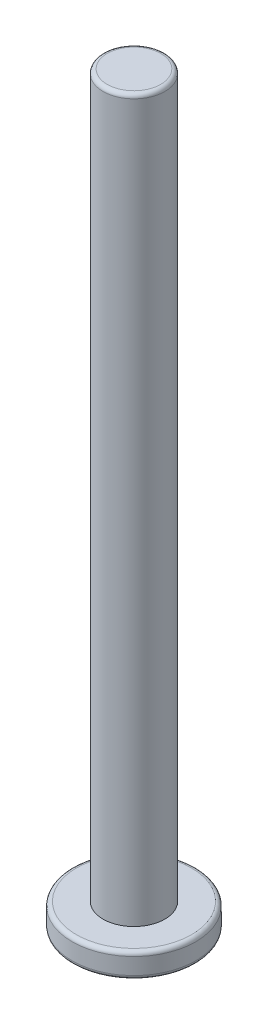
ISO-10303-21;
HEADER;
FILE_DESCRIPTION(('STEP AP214'),'2;1');
FILE_NAME('part.step','',(''),(''),'','','');
FILE_SCHEMA(('AUTOMOTIVE_DESIGN { 1 0 10303 214 1 1 1 1 }'));
ENDSEC;
DATA;
#1=APPLICATION_CONTEXT('core data for automotive mechanical design processes');
#2=APPLICATION_PROTOCOL_DEFINITION('international standard','automotive_design',2000,#1);
#3=PRODUCT_CONTEXT('',#1,'mechanical');
#4=PRODUCT('Part','Part','',(#3));
#5=PRODUCT_RELATED_PRODUCT_CATEGORY('part','',(#4));
#6=PRODUCT_DEFINITION_FORMATION('','',#4);
#7=PRODUCT_DEFINITION_CONTEXT('part definition',#1,'design');
#8=PRODUCT_DEFINITION('design','',#6,#7);
#9=PRODUCT_DEFINITION_SHAPE('','',#8);
#10=(LENGTH_UNIT() NAMED_UNIT(*) SI_UNIT(.MILLI.,.METRE.));
#11=(NAMED_UNIT(*) PLANE_ANGLE_UNIT() SI_UNIT($,.RADIAN.));
#12=(NAMED_UNIT(*) SI_UNIT($,.STERADIAN.) SOLID_ANGLE_UNIT());
#13=UNCERTAINTY_MEASURE_WITH_UNIT(LENGTH_MEASURE(1.E-05),#10,'distance_accuracy_value','');
#14=(GEOMETRIC_REPRESENTATION_CONTEXT(3) GLOBAL_UNCERTAINTY_ASSIGNED_CONTEXT((#13)) GLOBAL_UNIT_ASSIGNED_CONTEXT((#10,
#11,#12)) REPRESENTATION_CONTEXT('',''));
#15=CARTESIAN_POINT('',(0.,0.,0.));
#16=DIRECTION('',(0.,0.,1.));
#17=DIRECTION('',(1.,0.,0.));
#18=AXIS2_PLACEMENT_3D('',#15,#16,#17);
#19=CARTESIAN_POINT('',(0.,0.,0.));
#20=DIRECTION('',(0.,1.,0.));
#21=DIRECTION('',(0.,0.,1.));
#22=AXIS2_PLACEMENT_3D('',#19,#20,#21);
#23=PLANE('',#22);
#24=DIRECTION('',(-0.5,0.,0.866025403784439));
#25=VECTOR('',#24,1.);
#26=CARTESIAN_POINT('',(1.44337567297406,0.,0.));
#27=LINE('',#26,#25);
#28=CARTESIAN_POINT('',(1.44337567297406,0.,0.));
#29=VERTEX_POINT('',#28);
#30=CARTESIAN_POINT('',(0.721687836487032,0.,1.25));
#31=VERTEX_POINT('',#30);
#32=EDGE_CURVE('E122',#29,#31,#27,.T.);
#33=ORIENTED_EDGE('',*,*,#32,.F.);
#34=DIRECTION('',(0.5,0.,0.866025403784439));
#35=VECTOR('',#34,1.);
#36=CARTESIAN_POINT('',(0.721687836487032,0.,-1.25));
#37=LINE('',#36,#35);
#38=CARTESIAN_POINT('',(0.721687836487032,0.,-1.25));
#39=VERTEX_POINT('',#38);
#40=EDGE_CURVE('E48',#39,#29,#37,.T.);
#41=ORIENTED_EDGE('',*,*,#40,.F.);
#42=DIRECTION('',(1.,0.,0.));
#43=VECTOR('',#42,1.);
#44=CARTESIAN_POINT('',(-0.721687836487032,0.,-1.25));
#45=LINE('',#44,#43);
#46=CARTESIAN_POINT('',(-0.721687836487032,0.,-1.25));
#47=VERTEX_POINT('',#46);
#48=EDGE_CURVE('E131',#47,#39,#45,.T.);
#49=ORIENTED_EDGE('',*,*,#48,.F.);
#50=DIRECTION('',(0.5,0.,-0.866025403784439));
#51=VECTOR('',#50,1.);
#52=CARTESIAN_POINT('',(-1.44337567297407,0.,0.));
#53=LINE('',#52,#51);
#54=CARTESIAN_POINT('',(-1.44337567297407,0.,0.));
#55=VERTEX_POINT('',#54);
#56=EDGE_CURVE('E129',#55,#47,#53,.T.);
#57=ORIENTED_EDGE('',*,*,#56,.F.);
#58=DIRECTION('',(-0.5,0.,-0.866025403784439));
#59=VECTOR('',#58,1.);
#60=CARTESIAN_POINT('',(-0.721687836487033,0.,1.25));
#61=LINE('',#60,#59);
#62=CARTESIAN_POINT('',(-0.721687836487033,0.,1.25));
#63=VERTEX_POINT('',#62);
#64=EDGE_CURVE('E96',#63,#55,#61,.T.);
#65=ORIENTED_EDGE('',*,*,#64,.F.);
#66=DIRECTION('',(-1.,0.,0.));
#67=VECTOR('',#66,1.);
#68=CARTESIAN_POINT('',(0.721687836487032,0.,1.25));
#69=LINE('',#68,#67);
#70=EDGE_CURVE('E125',#31,#63,#69,.T.);
#71=ORIENTED_EDGE('',*,*,#70,.F.);
#72=EDGE_LOOP('',(#33,#41,#49,#57,#65,#71));
#73=FACE_BOUND('',#72,.T.);
#74=CARTESIAN_POINT('',(0.,0.,0.));
#75=DIRECTION('',(0.,1.,0.));
#76=DIRECTION('',(0.,0.,1.));
#77=AXIS2_PLACEMENT_3D('',#74,#75,#76);
#78=CIRCLE('',#77,2.8);
#79=CARTESIAN_POINT('',(0.,0.,2.8));
#80=VERTEX_POINT('',#79);
#81=EDGE_CURVE('E11',#80,#80,#78,.F.);
#82=ORIENTED_EDGE('',*,*,#81,.T.);
#83=EDGE_LOOP('',(#82));
#84=FACE_BOUND('',#83,.T.);
#85=ADVANCED_FACE('F33',(#73,#84),#23,.F.);
#86=CARTESIAN_POINT('',(0.,73.1142663620776,0.));
#87=DIRECTION('',(0.,1.,0.));
#88=DIRECTION('',(0.,0.,1.));
#89=AXIS2_PLACEMENT_3D('',#86,#87,#88);
#90=CYLINDRICAL_SURFACE('',#89,3.);
#91=CARTESIAN_POINT('',(0.,1.,0.));
#92=DIRECTION('',(0.,-1.,0.));
#93=DIRECTION('',(0.,0.,-1.));
#94=AXIS2_PLACEMENT_3D('',#91,#92,#93);
#95=CIRCLE('',#94,3.);
#96=CARTESIAN_POINT('',(0.,1.,-3.));
#97=VERTEX_POINT('',#96);
#98=EDGE_CURVE('E149',#97,#97,#95,.T.);
#99=ORIENTED_EDGE('',*,*,#98,.T.);
#100=EDGE_LOOP('',(#99));
#101=FACE_BOUND('',#100,.T.);
#102=CARTESIAN_POINT('',(0.,0.200000000000006,0.));
#103=DIRECTION('',(0.,1.,0.));
#104=DIRECTION('',(0.,0.,1.));
#105=AXIS2_PLACEMENT_3D('',#102,#103,#104);
#106=CIRCLE('',#105,3.);
#107=CARTESIAN_POINT('',(0.,0.200000000000006,3.));
#108=VERTEX_POINT('',#107);
#109=EDGE_CURVE('E146',#108,#108,#106,.T.);
#110=ORIENTED_EDGE('',*,*,#109,.T.);
#111=EDGE_LOOP('',(#110));
#112=FACE_BOUND('',#111,.T.);
#113=ADVANCED_FACE('F179',(#101,#112),#90,.T.);
#114=CARTESIAN_POINT('',(3.,1.2,0.));
#115=DIRECTION('',(0.,-1.,0.));
#116=DIRECTION('',(0.,0.,-1.));
#117=AXIS2_PLACEMENT_3D('',#114,#115,#116);
#118=PLANE('',#117);
#119=CARTESIAN_POINT('',(0.,1.2,0.));
#120=DIRECTION('',(0.,-1.,0.));
#121=DIRECTION('',(0.,0.,-1.));
#122=AXIS2_PLACEMENT_3D('',#119,#120,#121);
#123=CIRCLE('',#122,2.8);
#124=CARTESIAN_POINT('',(0.,1.2,-2.8));
#125=VERTEX_POINT('',#124);
#126=EDGE_CURVE('E143',#125,#125,#123,.F.);
#127=ORIENTED_EDGE('',*,*,#126,.T.);
#128=EDGE_LOOP('',(#127));
#129=FACE_BOUND('',#128,.T.);
#130=CARTESIAN_POINT('',(0.,1.19999999999999,0.));
#131=DIRECTION('',(0.,1.,0.));
#132=DIRECTION('',(0.,0.,1.));
#133=AXIS2_PLACEMENT_3D('',#130,#131,#132);
#134=CIRCLE('',#133,1.5);
#135=CARTESIAN_POINT('',(0.,1.19999999999999,1.5));
#136=VERTEX_POINT('',#135);
#137=EDGE_CURVE('E135',#136,#136,#134,.T.);
#138=ORIENTED_EDGE('',*,*,#137,.F.);
#139=EDGE_LOOP('',(#138));
#140=FACE_BOUND('',#139,.T.);
#141=ADVANCED_FACE('F175',(#129,#140),#118,.F.);
#142=CARTESIAN_POINT('',(0.,73.1142663620776,0.));
#143=DIRECTION('',(0.,1.,0.));
#144=DIRECTION('',(0.,0.,1.));
#145=AXIS2_PLACEMENT_3D('',#142,#143,#144);
#146=CYLINDRICAL_SURFACE('',#145,1.5);
#147=CARTESIAN_POINT('',(0.,36.,0.));
#148=DIRECTION('',(0.,-1.,0.));
#149=DIRECTION('',(0.,0.,-1.));
#150=AXIS2_PLACEMENT_3D('',#147,#148,#149);
#151=CIRCLE('',#150,1.5);
#152=CARTESIAN_POINT('',(0.,36.,-1.5));
#153=VERTEX_POINT('',#152);
#154=EDGE_CURVE('E41',#153,#153,#151,.T.);
#155=ORIENTED_EDGE('',*,*,#154,.T.);
#156=EDGE_LOOP('',(#155));
#157=FACE_BOUND('',#156,.T.);
#158=ORIENTED_EDGE('',*,*,#137,.T.);
#159=EDGE_LOOP('',(#158));
#160=FACE_BOUND('',#159,.T.);
#161=ADVANCED_FACE('F157',(#157,#160),#146,.T.);
#162=CARTESIAN_POINT('',(1.5,36.2,0.));
#163=DIRECTION('',(0.,-1.,0.));
#164=DIRECTION('',(0.,0.,-1.));
#165=AXIS2_PLACEMENT_3D('',#162,#163,#164);
#166=PLANE('',#165);
#167=CARTESIAN_POINT('',(0.,36.2,0.));
#168=DIRECTION('',(0.,-1.,0.));
#169=DIRECTION('',(0.,0.,-1.));
#170=AXIS2_PLACEMENT_3D('',#167,#168,#169);
#171=CIRCLE('',#170,1.3);
#172=CARTESIAN_POINT('',(0.,36.2,-1.3));
#173=VERTEX_POINT('',#172);
#174=EDGE_CURVE('E152',#173,#173,#171,.F.);
#175=ORIENTED_EDGE('',*,*,#174,.T.);
#176=EDGE_LOOP('',(#175));
#177=FACE_BOUND('',#176,.T.);
#178=ADVANCED_FACE('F166',(#177),#166,.F.);
#179=CARTESIAN_POINT('',(0.,1.,0.));
#180=DIRECTION('',(0.,-1.,0.));
#181=DIRECTION('',(0.,0.,-1.));
#182=AXIS2_PLACEMENT_3D('',#179,#180,#181);
#183=TOROIDAL_SURFACE('',#182,2.8,0.2);
#184=ORIENTED_EDGE('',*,*,#98,.F.);
#185=EDGE_LOOP('',(#184));
#186=FACE_BOUND('',#185,.T.);
#187=ORIENTED_EDGE('',*,*,#126,.F.);
#188=EDGE_LOOP('',(#187));
#189=FACE_BOUND('',#188,.T.);
#190=ADVANCED_FACE('F163',(#186,#189),#183,.T.);
#191=CARTESIAN_POINT('',(0.,36.,0.));
#192=DIRECTION('',(0.,-1.,0.));
#193=DIRECTION('',(0.,0.,-1.));
#194=AXIS2_PLACEMENT_3D('',#191,#192,#193);
#195=TOROIDAL_SURFACE('',#194,1.3,0.2);
#196=ORIENTED_EDGE('',*,*,#154,.F.);
#197=EDGE_LOOP('',(#196));
#198=FACE_BOUND('',#197,.T.);
#199=ORIENTED_EDGE('',*,*,#174,.F.);
#200=EDGE_LOOP('',(#199));
#201=FACE_BOUND('',#200,.T.);
#202=ADVANCED_FACE('F160',(#198,#201),#195,.T.);
#203=CARTESIAN_POINT('',(0.,0.200000000000006,0.));
#204=DIRECTION('',(0.,1.,0.));
#205=DIRECTION('',(0.,0.,1.));
#206=AXIS2_PLACEMENT_3D('',#203,#204,#205);
#207=TOROIDAL_SURFACE('',#206,2.8,0.2);
#208=ORIENTED_EDGE('',*,*,#81,.F.);
#209=EDGE_LOOP('',(#208));
#210=FACE_BOUND('',#209,.T.);
#211=ORIENTED_EDGE('',*,*,#109,.F.);
#212=EDGE_LOOP('',(#211));
#213=FACE_BOUND('',#212,.T.);
#214=ADVANCED_FACE('F35',(#210,#213),#207,.T.);
#215=CARTESIAN_POINT('',(0.721687836487032,1.,-1.25));
#216=DIRECTION('',(0.866025403784439,0.,-0.5));
#217=DIRECTION('',(-0.5,0.,-0.866025403784439));
#218=AXIS2_PLACEMENT_3D('',#215,#216,#217);
#219=PLANE('',#218);
#220=ORIENTED_EDGE('',*,*,#40,.T.);
#221=DIRECTION('',(0.,-1.,0.));
#222=VECTOR('',#221,1.);
#223=CARTESIAN_POINT('',(1.44337567297406,1.,0.));
#224=LINE('',#223,#222);
#225=CARTESIAN_POINT('',(1.44337567297406,1.,0.));
#226=VERTEX_POINT('',#225);
#227=EDGE_CURVE('E78',#226,#29,#224,.T.);
#228=ORIENTED_EDGE('',*,*,#227,.F.);
#229=DIRECTION('',(0.5,0.,0.866025403784439));
#230=VECTOR('',#229,1.);
#231=CARTESIAN_POINT('',(0.721687836487032,1.,-1.25));
#232=LINE('',#231,#230);
#233=CARTESIAN_POINT('',(0.721687836487032,1.,-1.25));
#234=VERTEX_POINT('',#233);
#235=EDGE_CURVE('E133',#234,#226,#232,.T.);
#236=ORIENTED_EDGE('',*,*,#235,.F.);
#237=DIRECTION('',(0.,-1.,0.));
#238=VECTOR('',#237,1.);
#239=CARTESIAN_POINT('',(0.721687836487032,1.,-1.25));
#240=LINE('',#239,#238);
#241=EDGE_CURVE('E56',#234,#39,#240,.T.);
#242=ORIENTED_EDGE('',*,*,#241,.T.);
#243=EDGE_LOOP('',(#220,#228,#236,#242));
#244=FACE_BOUND('',#243,.T.);
#245=ADVANCED_FACE('F228',(#244),#219,.F.);
#246=CARTESIAN_POINT('',(-0.721687836487032,1.,-1.25));
#247=DIRECTION('',(0.,0.,-1.));
#248=DIRECTION('',(-1.,0.,0.));
#249=AXIS2_PLACEMENT_3D('',#246,#247,#248);
#250=PLANE('',#249);
#251=ORIENTED_EDGE('',*,*,#48,.T.);
#252=ORIENTED_EDGE('',*,*,#241,.F.);
#253=DIRECTION('',(1.,0.,0.));
#254=VECTOR('',#253,1.);
#255=CARTESIAN_POINT('',(-0.721687836487032,1.,-1.25));
#256=LINE('',#255,#254);
#257=CARTESIAN_POINT('',(-0.721687836487032,1.,-1.25));
#258=VERTEX_POINT('',#257);
#259=EDGE_CURVE('E108',#258,#234,#256,.T.);
#260=ORIENTED_EDGE('',*,*,#259,.F.);
#261=DIRECTION('',(0.,-1.,0.));
#262=VECTOR('',#261,1.);
#263=CARTESIAN_POINT('',(-0.721687836487032,1.,-1.25));
#264=LINE('',#263,#262);
#265=EDGE_CURVE('E100',#258,#47,#264,.T.);
#266=ORIENTED_EDGE('',*,*,#265,.T.);
#267=EDGE_LOOP('',(#251,#252,#260,#266));
#268=FACE_BOUND('',#267,.T.);
#269=ADVANCED_FACE('F243',(#268),#250,.F.);
#270=CARTESIAN_POINT('',(-1.44337567297407,1.,0.));
#271=DIRECTION('',(-0.866025403784439,0.,-0.5));
#272=DIRECTION('',(-0.5,0.,0.866025403784439));
#273=AXIS2_PLACEMENT_3D('',#270,#271,#272);
#274=PLANE('',#273);
#275=ORIENTED_EDGE('',*,*,#56,.T.);
#276=ORIENTED_EDGE('',*,*,#265,.F.);
#277=DIRECTION('',(0.5,0.,-0.866025403784439));
#278=VECTOR('',#277,1.);
#279=CARTESIAN_POINT('',(-1.44337567297407,1.,0.));
#280=LINE('',#279,#278);
#281=CARTESIAN_POINT('',(-1.44337567297407,1.,0.));
#282=VERTEX_POINT('',#281);
#283=EDGE_CURVE('E104',#282,#258,#280,.T.);
#284=ORIENTED_EDGE('',*,*,#283,.F.);
#285=DIRECTION('',(0.,-1.,0.));
#286=VECTOR('',#285,1.);
#287=CARTESIAN_POINT('',(-1.44337567297407,1.,0.));
#288=LINE('',#287,#286);
#289=EDGE_CURVE('E89',#282,#55,#288,.T.);
#290=ORIENTED_EDGE('',*,*,#289,.T.);
#291=EDGE_LOOP('',(#275,#276,#284,#290));
#292=FACE_BOUND('',#291,.T.);
#293=ADVANCED_FACE('F105',(#292),#274,.F.);
#294=CARTESIAN_POINT('',(-0.721687836487033,1.,1.25));
#295=DIRECTION('',(-0.866025403784439,0.,0.5));
#296=DIRECTION('',(0.5,0.,0.866025403784439));
#297=AXIS2_PLACEMENT_3D('',#294,#295,#296);
#298=PLANE('',#297);
#299=ORIENTED_EDGE('',*,*,#64,.T.);
#300=ORIENTED_EDGE('',*,*,#289,.F.);
#301=DIRECTION('',(-0.5,0.,-0.866025403784439));
#302=VECTOR('',#301,1.);
#303=CARTESIAN_POINT('',(-0.721687836487033,1.,1.25));
#304=LINE('',#303,#302);
#305=CARTESIAN_POINT('',(-0.721687836487033,1.,1.25));
#306=VERTEX_POINT('',#305);
#307=EDGE_CURVE('E93',#306,#282,#304,.T.);
#308=ORIENTED_EDGE('',*,*,#307,.F.);
#309=DIRECTION('',(0.,-1.,0.));
#310=VECTOR('',#309,1.);
#311=CARTESIAN_POINT('',(-0.721687836487033,1.,1.25));
#312=LINE('',#311,#310);
#313=EDGE_CURVE('E101',#306,#63,#312,.T.);
#314=ORIENTED_EDGE('',*,*,#313,.T.);
#315=EDGE_LOOP('',(#299,#300,#308,#314));
#316=FACE_BOUND('',#315,.T.);
#317=ADVANCED_FACE('F91',(#316),#298,.F.);
#318=CARTESIAN_POINT('',(0.721687836487032,1.,1.25));
#319=DIRECTION('',(0.,0.,1.));
#320=DIRECTION('',(1.,0.,0.));
#321=AXIS2_PLACEMENT_3D('',#318,#319,#320);
#322=PLANE('',#321);
#323=ORIENTED_EDGE('',*,*,#70,.T.);
#324=ORIENTED_EDGE('',*,*,#313,.F.);
#325=DIRECTION('',(-1.,0.,0.));
#326=VECTOR('',#325,1.);
#327=CARTESIAN_POINT('',(0.721687836487032,1.,1.25));
#328=LINE('',#327,#326);
#329=CARTESIAN_POINT('',(0.721687836487032,1.,1.25));
#330=VERTEX_POINT('',#329);
#331=EDGE_CURVE('E114',#330,#306,#328,.T.);
#332=ORIENTED_EDGE('',*,*,#331,.F.);
#333=DIRECTION('',(0.,-1.,0.));
#334=VECTOR('',#333,1.);
#335=CARTESIAN_POINT('',(0.721687836487032,1.,1.25));
#336=LINE('',#335,#334);
#337=EDGE_CURVE('E138',#330,#31,#336,.T.);
#338=ORIENTED_EDGE('',*,*,#337,.T.);
#339=EDGE_LOOP('',(#323,#324,#332,#338));
#340=FACE_BOUND('',#339,.T.);
#341=ADVANCED_FACE('F267',(#340),#322,.F.);
#342=CARTESIAN_POINT('',(1.44337567297406,1.,0.));
#343=DIRECTION('',(0.866025403784439,0.,0.5));
#344=DIRECTION('',(0.5,0.,-0.866025403784439));
#345=AXIS2_PLACEMENT_3D('',#342,#343,#344);
#346=PLANE('',#345);
#347=ORIENTED_EDGE('',*,*,#32,.T.);
#348=ORIENTED_EDGE('',*,*,#337,.F.);
#349=DIRECTION('',(-0.5,0.,0.866025403784439));
#350=VECTOR('',#349,1.);
#351=CARTESIAN_POINT('',(1.44337567297406,1.,0.));
#352=LINE('',#351,#350);
#353=EDGE_CURVE('E116',#226,#330,#352,.T.);
#354=ORIENTED_EDGE('',*,*,#353,.F.);
#355=ORIENTED_EDGE('',*,*,#227,.T.);
#356=EDGE_LOOP('',(#347,#348,#354,#355));
#357=FACE_BOUND('',#356,.T.);
#358=ADVANCED_FACE('F276',(#357),#346,.F.);
#359=CARTESIAN_POINT('',(0.,1.,0.));
#360=DIRECTION('',(0.,-1.,0.));
#361=DIRECTION('',(0.,0.,-1.));
#362=AXIS2_PLACEMENT_3D('',#359,#360,#361);
#363=PLANE('',#362);
#364=ORIENTED_EDGE('',*,*,#235,.T.);
#365=ORIENTED_EDGE('',*,*,#353,.T.);
#366=ORIENTED_EDGE('',*,*,#331,.T.);
#367=ORIENTED_EDGE('',*,*,#307,.T.);
#368=ORIENTED_EDGE('',*,*,#283,.T.);
#369=ORIENTED_EDGE('',*,*,#259,.T.);
#370=EDGE_LOOP('',(#364,#365,#366,#367,#368,#369));
#371=FACE_BOUND('',#370,.T.);
#372=ADVANCED_FACE('F111',(#371),#363,.T.);
#373=CLOSED_SHELL('',(#85,#113,#141,#161,#178,#190,#202,#214,#245,#269,#293,#317,#341,#358,#372));
#374=MANIFOLD_SOLID_BREP('B2',#373);
#375=ADVANCED_BREP_SHAPE_REPRESENTATION('',(#18,#374),#14);
#376=SHAPE_DEFINITION_REPRESENTATION(#9,#375);
ENDSEC;
END-ISO-10303-21;
